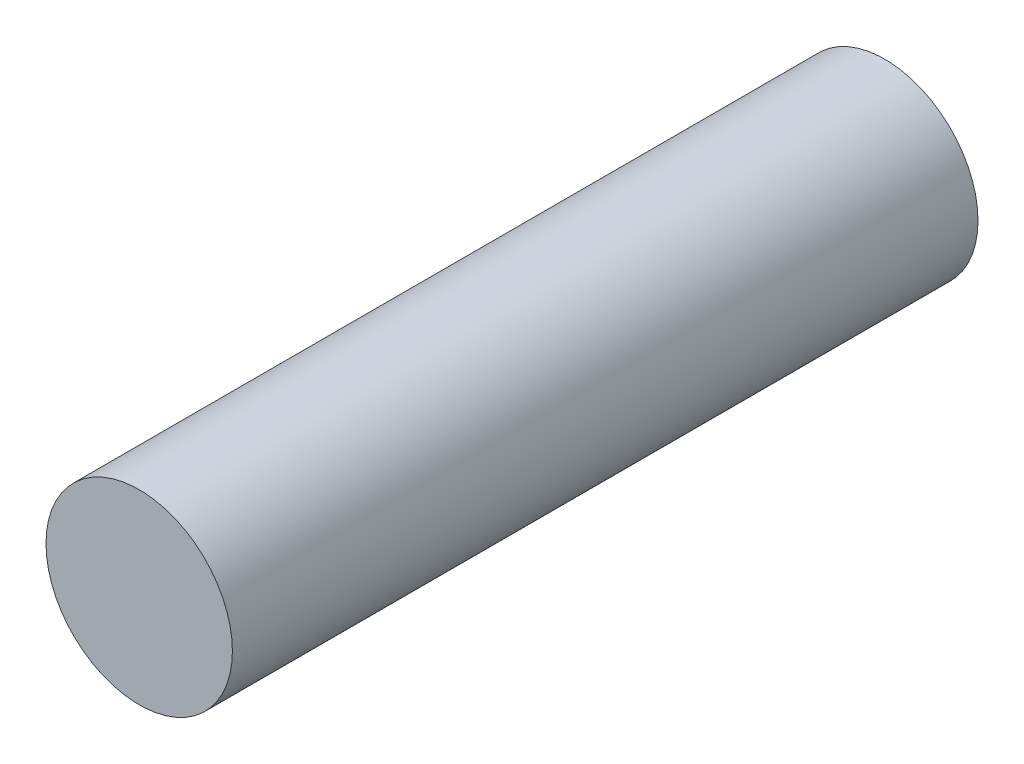
ISO-10303-21;
HEADER;
FILE_DESCRIPTION(('STEP AP214'),'2;1');
FILE_NAME('part.step','',(''),(''),'','','');
FILE_SCHEMA(('AUTOMOTIVE_DESIGN { 1 0 10303 214 1 1 1 1 }'));
ENDSEC;
DATA;
#1=APPLICATION_CONTEXT('core data for automotive mechanical design processes');
#2=APPLICATION_PROTOCOL_DEFINITION('international standard','automotive_design',2000,#1);
#3=PRODUCT_CONTEXT('',#1,'mechanical');
#4=PRODUCT('Part','Part','',(#3));
#5=PRODUCT_RELATED_PRODUCT_CATEGORY('part','',(#4));
#6=PRODUCT_DEFINITION_FORMATION('','',#4);
#7=PRODUCT_DEFINITION_CONTEXT('part definition',#1,'design');
#8=PRODUCT_DEFINITION('design','',#6,#7);
#9=PRODUCT_DEFINITION_SHAPE('','',#8);
#10=(LENGTH_UNIT() NAMED_UNIT(*) SI_UNIT(.MILLI.,.METRE.));
#11=(NAMED_UNIT(*) PLANE_ANGLE_UNIT() SI_UNIT($,.RADIAN.));
#12=(NAMED_UNIT(*) SI_UNIT($,.STERADIAN.) SOLID_ANGLE_UNIT());
#13=UNCERTAINTY_MEASURE_WITH_UNIT(LENGTH_MEASURE(1.E-05),#10,'distance_accuracy_value','');
#14=(GEOMETRIC_REPRESENTATION_CONTEXT(3) GLOBAL_UNCERTAINTY_ASSIGNED_CONTEXT((#13)) GLOBAL_UNIT_ASSIGNED_CONTEXT((#10,
#11,#12)) REPRESENTATION_CONTEXT('',''));
#15=CARTESIAN_POINT('',(0.,0.,0.));
#16=DIRECTION('',(0.,0.,1.));
#17=DIRECTION('',(1.,0.,0.));
#18=AXIS2_PLACEMENT_3D('',#15,#16,#17);
#19=CARTESIAN_POINT('',(0.,0.,2000.));
#20=DIRECTION('',(0.,0.,-1.));
#21=DIRECTION('',(-1.,0.,0.));
#22=AXIS2_PLACEMENT_3D('',#19,#20,#21);
#23=CYLINDRICAL_SURFACE('',#22,500.);
#24=CARTESIAN_POINT('',(0.,0.,2000.));
#25=DIRECTION('',(0.,0.,1.));
#26=DIRECTION('',(1.,0.,0.));
#27=AXIS2_PLACEMENT_3D('',#24,#25,#26);
#28=CIRCLE('',#27,500.);
#29=CARTESIAN_POINT('',(500.,0.,2000.));
#30=VERTEX_POINT('',#29);
#31=EDGE_CURVE('E10',#30,#30,#28,.T.);
#32=ORIENTED_EDGE('',*,*,#31,.F.);
#33=EDGE_LOOP('',(#32));
#34=FACE_BOUND('',#33,.T.);
#35=CARTESIAN_POINT('',(0.,0.,-2000.));
#36=DIRECTION('',(0.,0.,1.));
#37=DIRECTION('',(1.,0.,0.));
#38=AXIS2_PLACEMENT_3D('',#35,#36,#37);
#39=CIRCLE('',#38,500.);
#40=CARTESIAN_POINT('',(500.,0.,-2000.));
#41=VERTEX_POINT('',#40);
#42=EDGE_CURVE('E40',#41,#41,#39,.T.);
#43=ORIENTED_EDGE('',*,*,#42,.T.);
#44=EDGE_LOOP('',(#43));
#45=FACE_BOUND('',#44,.T.);
#46=ADVANCED_FACE('F37',(#34,#45),#23,.T.);
#47=CARTESIAN_POINT('',(0.,0.,2000.));
#48=DIRECTION('',(0.,0.,1.));
#49=DIRECTION('',(1.,0.,0.));
#50=AXIS2_PLACEMENT_3D('',#47,#48,#49);
#51=PLANE('',#50);
#52=ORIENTED_EDGE('',*,*,#31,.T.);
#53=EDGE_LOOP('',(#52));
#54=FACE_BOUND('',#53,.T.);
#55=ADVANCED_FACE('F54',(#54),#51,.T.);
#56=CARTESIAN_POINT('',(0.,0.,-2000.));
#57=DIRECTION('',(0.,0.,1.));
#58=DIRECTION('',(1.,0.,0.));
#59=AXIS2_PLACEMENT_3D('',#56,#57,#58);
#60=PLANE('',#59);
#61=ORIENTED_EDGE('',*,*,#42,.F.);
#62=EDGE_LOOP('',(#61));
#63=FACE_BOUND('',#62,.T.);
#64=ADVANCED_FACE('F52',(#63),#60,.F.);
#65=CLOSED_SHELL('',(#46,#55,#64));
#66=MANIFOLD_SOLID_BREP('B2',#65);
#67=ADVANCED_BREP_SHAPE_REPRESENTATION('',(#18,#66),#14);
#68=SHAPE_DEFINITION_REPRESENTATION(#9,#67);
ENDSEC;
END-ISO-10303-21;
